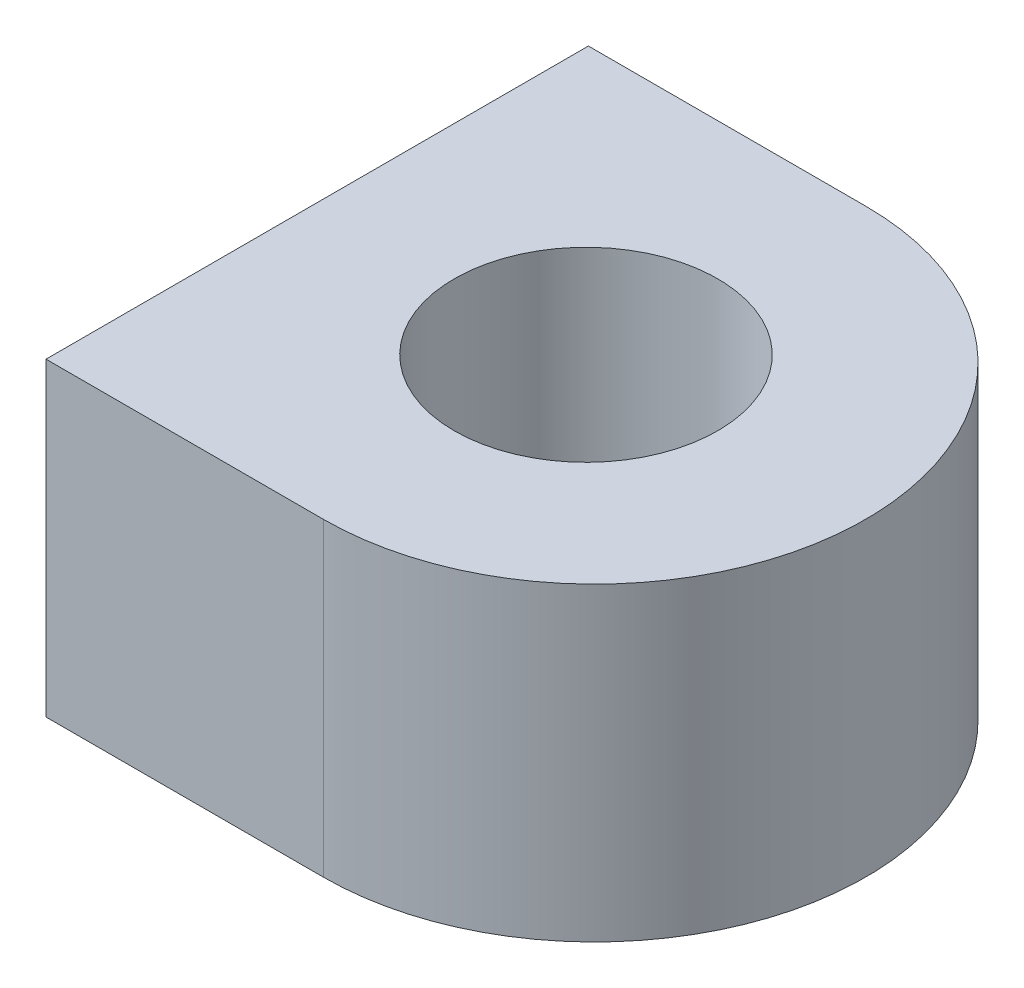
ISO-10303-21;
HEADER;
FILE_DESCRIPTION(('STEP AP214'),'2;1');
FILE_NAME('part.step','',(''),(''),'','','');
FILE_SCHEMA(('AUTOMOTIVE_DESIGN { 1 0 10303 214 1 1 1 1 }'));
ENDSEC;
DATA;
#1=APPLICATION_CONTEXT('core data for automotive mechanical design processes');
#2=APPLICATION_PROTOCOL_DEFINITION('international standard','automotive_design',2000,#1);
#3=PRODUCT_CONTEXT('',#1,'mechanical');
#4=PRODUCT('Part','Part','',(#3));
#5=PRODUCT_RELATED_PRODUCT_CATEGORY('part','',(#4));
#6=PRODUCT_DEFINITION_FORMATION('','',#4);
#7=PRODUCT_DEFINITION_CONTEXT('part definition',#1,'design');
#8=PRODUCT_DEFINITION('design','',#6,#7);
#9=PRODUCT_DEFINITION_SHAPE('','',#8);
#10=(LENGTH_UNIT() NAMED_UNIT(*) SI_UNIT(.MILLI.,.METRE.));
#11=(NAMED_UNIT(*) PLANE_ANGLE_UNIT() SI_UNIT($,.RADIAN.));
#12=(NAMED_UNIT(*) SI_UNIT($,.STERADIAN.) SOLID_ANGLE_UNIT());
#13=UNCERTAINTY_MEASURE_WITH_UNIT(LENGTH_MEASURE(1.E-05),#10,'distance_accuracy_value','');
#14=(GEOMETRIC_REPRESENTATION_CONTEXT(3) GLOBAL_UNCERTAINTY_ASSIGNED_CONTEXT((#13)) GLOBAL_UNIT_ASSIGNED_CONTEXT((#10,
#11,#12)) REPRESENTATION_CONTEXT('',''));
#15=CARTESIAN_POINT('',(0.,0.,0.));
#16=DIRECTION('',(0.,0.,1.));
#17=DIRECTION('',(1.,0.,0.));
#18=AXIS2_PLACEMENT_3D('',#15,#16,#17);
#19=CARTESIAN_POINT('',(0.143666225857325,4.,0.033363683393497));
#20=DIRECTION('',(0.,-1.,0.));
#21=DIRECTION('',(0.,0.,-1.));
#22=AXIS2_PLACEMENT_3D('',#19,#20,#21);
#23=PLANE('',#22);
#24=DIRECTION('',(0.,0.,1.));
#25=VECTOR('',#24,1.);
#26=CARTESIAN_POINT('',(-3.43579487814067,4.,0.033363683393497));
#27=LINE('',#26,#25);
#28=CARTESIAN_POINT('',(-3.43579487814067,4.,-3.4666363166065));
#29=VERTEX_POINT('',#28);
#30=CARTESIAN_POINT('',(-3.43579487814067,4.,3.5333636833935));
#31=VERTEX_POINT('',#30);
#32=EDGE_CURVE('E57',#29,#31,#27,.T.);
#33=ORIENTED_EDGE('',*,*,#32,.T.);
#34=DIRECTION('',(1.,0.,0.));
#35=VECTOR('',#34,1.);
#36=CARTESIAN_POINT('',(-3.43579487814067,4.,3.5333636833935));
#37=LINE('',#36,#35);
#38=CARTESIAN_POINT('',(0.143666225857325,4.,3.5333636833935));
#39=VERTEX_POINT('',#38);
#40=EDGE_CURVE('E88',#31,#39,#37,.T.);
#41=ORIENTED_EDGE('',*,*,#40,.T.);
#42=CARTESIAN_POINT('',(0.143666225857325,4.,0.033363683393497));
#43=DIRECTION('',(0.,1.,0.));
#44=DIRECTION('',(0.,0.,-1.));
#45=AXIS2_PLACEMENT_3D('',#42,#43,#44);
#46=CIRCLE('',#45,3.5);
#47=CARTESIAN_POINT('',(0.143666225857325,4.,-3.4666363166065));
#48=VERTEX_POINT('',#47);
#49=EDGE_CURVE('E92',#39,#48,#46,.T.);
#50=ORIENTED_EDGE('',*,*,#49,.T.);
#51=DIRECTION('',(-1.,0.,0.));
#52=VECTOR('',#51,1.);
#53=CARTESIAN_POINT('',(-3.43579487814067,4.,-3.4666363166065));
#54=LINE('',#53,#52);
#55=EDGE_CURVE('E102',#48,#29,#54,.T.);
#56=ORIENTED_EDGE('',*,*,#55,.T.);
#57=EDGE_LOOP('',(#33,#41,#50,#56));
#58=FACE_BOUND('',#57,.T.);
#59=CARTESIAN_POINT('',(0.,4.,0.));
#60=DIRECTION('',(0.,1.,0.));
#61=DIRECTION('',(0.,0.,1.));
#62=AXIS2_PLACEMENT_3D('',#59,#60,#61);
#63=CIRCLE('',#62,1.7);
#64=CARTESIAN_POINT('',(0.,4.,1.7));
#65=VERTEX_POINT('',#64);
#66=EDGE_CURVE('E111',#65,#65,#63,.T.);
#67=ORIENTED_EDGE('',*,*,#66,.F.);
#68=EDGE_LOOP('',(#67));
#69=FACE_BOUND('',#68,.T.);
#70=ADVANCED_FACE('F39',(#58,#69),#23,.F.);
#71=CARTESIAN_POINT('',(0.143666225857325,0.,0.033363683393497));
#72=DIRECTION('',(0.,-1.,0.));
#73=DIRECTION('',(0.,0.,-1.));
#74=AXIS2_PLACEMENT_3D('',#71,#72,#73);
#75=PLANE('',#74);
#76=DIRECTION('',(1.,0.,0.));
#77=VECTOR('',#76,1.);
#78=CARTESIAN_POINT('',(-3.43579487814067,0.,3.5333636833935));
#79=LINE('',#78,#77);
#80=CARTESIAN_POINT('',(-3.43579487814067,0.,3.5333636833935));
#81=VERTEX_POINT('',#80);
#82=CARTESIAN_POINT('',(0.143666225857325,0.,3.5333636833935));
#83=VERTEX_POINT('',#82);
#84=EDGE_CURVE('E96',#81,#83,#79,.T.);
#85=ORIENTED_EDGE('',*,*,#84,.F.);
#86=DIRECTION('',(0.,0.,1.));
#87=VECTOR('',#86,1.);
#88=CARTESIAN_POINT('',(-3.43579487814067,0.,0.033363683393497));
#89=LINE('',#88,#87);
#90=CARTESIAN_POINT('',(-3.43579487814067,0.,-3.4666363166065));
#91=VERTEX_POINT('',#90);
#92=EDGE_CURVE('E116',#91,#81,#89,.T.);
#93=ORIENTED_EDGE('',*,*,#92,.F.);
#94=DIRECTION('',(-1.,0.,0.));
#95=VECTOR('',#94,1.);
#96=CARTESIAN_POINT('',(-3.43579487814067,0.,-3.4666363166065));
#97=LINE('',#96,#95);
#98=CARTESIAN_POINT('',(0.143666225857325,0.,-3.4666363166065));
#99=VERTEX_POINT('',#98);
#100=EDGE_CURVE('E82',#99,#91,#97,.T.);
#101=ORIENTED_EDGE('',*,*,#100,.F.);
#102=CARTESIAN_POINT('',(0.143666225857325,0.,0.033363683393497));
#103=DIRECTION('',(0.,1.,0.));
#104=DIRECTION('',(0.,0.,-1.));
#105=AXIS2_PLACEMENT_3D('',#102,#103,#104);
#106=CIRCLE('',#105,3.5);
#107=EDGE_CURVE('E75',#83,#99,#106,.T.);
#108=ORIENTED_EDGE('',*,*,#107,.F.);
#109=EDGE_LOOP('',(#85,#93,#101,#108));
#110=FACE_BOUND('',#109,.T.);
#111=CARTESIAN_POINT('',(0.,0.,0.));
#112=DIRECTION('',(0.,1.,0.));
#113=DIRECTION('',(0.,0.,1.));
#114=AXIS2_PLACEMENT_3D('',#111,#112,#113);
#115=CIRCLE('',#114,1.7);
#116=CARTESIAN_POINT('',(0.,0.,1.7));
#117=VERTEX_POINT('',#116);
#118=EDGE_CURVE('E192',#117,#117,#115,.T.);
#119=ORIENTED_EDGE('',*,*,#118,.T.);
#120=EDGE_LOOP('',(#119));
#121=FACE_BOUND('',#120,.T.);
#122=ADVANCED_FACE('F125',(#110,#121),#75,.T.);
#123=CARTESIAN_POINT('',(-3.43579487814067,4.,3.5333636833935));
#124=DIRECTION('',(0.,0.,-1.));
#125=DIRECTION('',(-1.,0.,0.));
#126=AXIS2_PLACEMENT_3D('',#123,#124,#125);
#127=PLANE('',#126);
#128=ORIENTED_EDGE('',*,*,#84,.T.);
#129=DIRECTION('',(0.,-1.,0.));
#130=VECTOR('',#129,1.);
#131=CARTESIAN_POINT('',(0.143666225857325,4.,3.5333636833935));
#132=LINE('',#131,#130);
#133=EDGE_CURVE('E49',#39,#83,#132,.T.);
#134=ORIENTED_EDGE('',*,*,#133,.F.);
#135=ORIENTED_EDGE('',*,*,#40,.F.);
#136=DIRECTION('',(0.,-1.,0.));
#137=VECTOR('',#136,1.);
#138=CARTESIAN_POINT('',(-3.43579487814067,4.,3.5333636833935));
#139=LINE('',#138,#137);
#140=EDGE_CURVE('E11',#31,#81,#139,.T.);
#141=ORIENTED_EDGE('',*,*,#140,.T.);
#142=EDGE_LOOP('',(#128,#134,#135,#141));
#143=FACE_BOUND('',#142,.T.);
#144=ADVANCED_FACE('F41',(#143),#127,.F.);
#145=CARTESIAN_POINT('',(0.143666225857325,4.,0.033363683393497));
#146=DIRECTION('',(0.,-1.,0.));
#147=DIRECTION('',(0.,0.,-1.));
#148=AXIS2_PLACEMENT_3D('',#145,#146,#147);
#149=CYLINDRICAL_SURFACE('',#148,3.5);
#150=ORIENTED_EDGE('',*,*,#107,.T.);
#151=DIRECTION('',(0.,-1.,0.));
#152=VECTOR('',#151,1.);
#153=CARTESIAN_POINT('',(0.143666225857325,4.,-3.4666363166065));
#154=LINE('',#153,#152);
#155=EDGE_CURVE('E98',#48,#99,#154,.T.);
#156=ORIENTED_EDGE('',*,*,#155,.F.);
#157=ORIENTED_EDGE('',*,*,#49,.F.);
#158=ORIENTED_EDGE('',*,*,#133,.T.);
#159=EDGE_LOOP('',(#150,#156,#157,#158));
#160=FACE_BOUND('',#159,.T.);
#161=ADVANCED_FACE('F99',(#160),#149,.T.);
#162=CARTESIAN_POINT('',(-3.43579487814067,4.,-3.4666363166065));
#163=DIRECTION('',(0.,0.,1.));
#164=DIRECTION('',(1.,0.,0.));
#165=AXIS2_PLACEMENT_3D('',#162,#163,#164);
#166=PLANE('',#165);
#167=ORIENTED_EDGE('',*,*,#100,.T.);
#168=DIRECTION('',(0.,-1.,0.));
#169=VECTOR('',#168,1.);
#170=CARTESIAN_POINT('',(-3.43579487814067,4.,-3.4666363166065));
#171=LINE('',#170,#169);
#172=EDGE_CURVE('E105',#29,#91,#171,.T.);
#173=ORIENTED_EDGE('',*,*,#172,.F.);
#174=ORIENTED_EDGE('',*,*,#55,.F.);
#175=ORIENTED_EDGE('',*,*,#155,.T.);
#176=EDGE_LOOP('',(#167,#173,#174,#175));
#177=FACE_BOUND('',#176,.T.);
#178=ADVANCED_FACE('F122',(#177),#166,.F.);
#179=CARTESIAN_POINT('',(-3.43579487814067,4.,0.033363683393497));
#180=DIRECTION('',(1.,0.,0.));
#181=DIRECTION('',(0.,0.,-1.));
#182=AXIS2_PLACEMENT_3D('',#179,#180,#181);
#183=PLANE('',#182);
#184=ORIENTED_EDGE('',*,*,#92,.T.);
#185=ORIENTED_EDGE('',*,*,#140,.F.);
#186=ORIENTED_EDGE('',*,*,#32,.F.);
#187=ORIENTED_EDGE('',*,*,#172,.T.);
#188=EDGE_LOOP('',(#184,#185,#186,#187));
#189=FACE_BOUND('',#188,.T.);
#190=ADVANCED_FACE('F127',(#189),#183,.F.);
#191=CARTESIAN_POINT('',(0.,4.,0.));
#192=DIRECTION('',(0.,-1.,0.));
#193=DIRECTION('',(0.,0.,-1.));
#194=AXIS2_PLACEMENT_3D('',#191,#192,#193);
#195=CYLINDRICAL_SURFACE('',#194,1.7);
#196=ORIENTED_EDGE('',*,*,#66,.T.);
#197=EDGE_LOOP('',(#196));
#198=FACE_BOUND('',#197,.T.);
#199=ORIENTED_EDGE('',*,*,#118,.F.);
#200=EDGE_LOOP('',(#199));
#201=FACE_BOUND('',#200,.T.);
#202=ADVANCED_FACE('F129',(#198,#201),#195,.F.);
#203=CLOSED_SHELL('',(#70,#122,#144,#161,#178,#190,#202));
#204=MANIFOLD_SOLID_BREP('B2',#203);
#205=ADVANCED_BREP_SHAPE_REPRESENTATION('',(#18,#204),#14);
#206=SHAPE_DEFINITION_REPRESENTATION(#9,#205);
ENDSEC;
END-ISO-10303-21;
